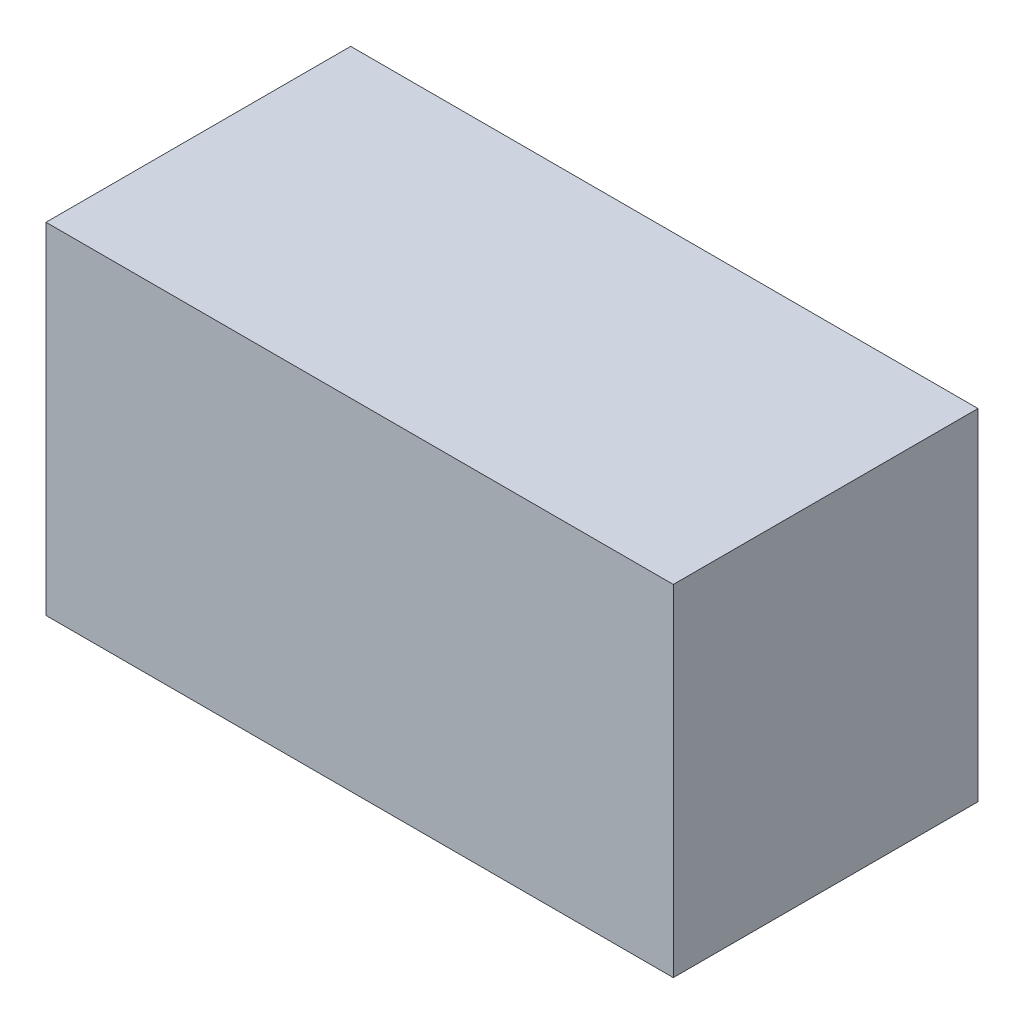
ISO-10303-21;
HEADER;
FILE_DESCRIPTION(('STEP AP214'),'2;1');
FILE_NAME('part.step','',(''),(''),'','','');
FILE_SCHEMA(('AUTOMOTIVE_DESIGN { 1 0 10303 214 1 1 1 1 }'));
ENDSEC;
DATA;
#1=APPLICATION_CONTEXT('core data for automotive mechanical design processes');
#2=APPLICATION_PROTOCOL_DEFINITION('international standard','automotive_design',2000,#1);
#3=PRODUCT_CONTEXT('',#1,'mechanical');
#4=PRODUCT('Part','Part','',(#3));
#5=PRODUCT_RELATED_PRODUCT_CATEGORY('part','',(#4));
#6=PRODUCT_DEFINITION_FORMATION('','',#4);
#7=PRODUCT_DEFINITION_CONTEXT('part definition',#1,'design');
#8=PRODUCT_DEFINITION('design','',#6,#7);
#9=PRODUCT_DEFINITION_SHAPE('','',#8);
#10=(LENGTH_UNIT() NAMED_UNIT(*) SI_UNIT(.MILLI.,.METRE.));
#11=(NAMED_UNIT(*) PLANE_ANGLE_UNIT() SI_UNIT($,.RADIAN.));
#12=(NAMED_UNIT(*) SI_UNIT($,.STERADIAN.) SOLID_ANGLE_UNIT());
#13=UNCERTAINTY_MEASURE_WITH_UNIT(LENGTH_MEASURE(1.E-05),#10,'distance_accuracy_value','');
#14=(GEOMETRIC_REPRESENTATION_CONTEXT(3) GLOBAL_UNCERTAINTY_ASSIGNED_CONTEXT((#13)) GLOBAL_UNIT_ASSIGNED_CONTEXT((#10,
#11,#12)) REPRESENTATION_CONTEXT('',''));
#15=CARTESIAN_POINT('',(0.,0.,0.));
#16=DIRECTION('',(0.,0.,1.));
#17=DIRECTION('',(1.,0.,0.));
#18=AXIS2_PLACEMENT_3D('',#15,#16,#17);
#19=CARTESIAN_POINT('',(-0.87499952,-0.47500032,0.85));
#20=DIRECTION('',(0.,0.,-1.));
#21=DIRECTION('',(-1.,0.,0.));
#22=AXIS2_PLACEMENT_3D('',#19,#20,#21);
#23=PLANE('',#22);
#24=DIRECTION('',(0.,1.,0.));
#25=VECTOR('',#24,1.);
#26=CARTESIAN_POINT('',(0.87499952,-0.47500032,0.85));
#27=LINE('',#26,#25);
#28=CARTESIAN_POINT('',(0.87499952,0.47500032,0.85));
#29=VERTEX_POINT('',#28);
#30=CARTESIAN_POINT('',(0.87499952,-0.47500032,0.85));
#31=VERTEX_POINT('',#30);
#32=EDGE_CURVE('E20',#29,#31,#27,.F.);
#33=ORIENTED_EDGE('',*,*,#32,.F.);
#34=DIRECTION('',(1.,0.,0.));
#35=VECTOR('',#34,1.);
#36=CARTESIAN_POINT('',(0.87499952,0.47500032,0.85));
#37=LINE('',#36,#35);
#38=CARTESIAN_POINT('',(-0.87499952,0.47500032,0.85));
#39=VERTEX_POINT('',#38);
#40=EDGE_CURVE('E55',#29,#39,#37,.F.);
#41=ORIENTED_EDGE('',*,*,#40,.T.);
#42=DIRECTION('',(0.,1.,0.));
#43=VECTOR('',#42,1.);
#44=CARTESIAN_POINT('',(-0.87499952,0.47500032,0.85));
#45=LINE('',#44,#43);
#46=CARTESIAN_POINT('',(-0.87499952,-0.47500032,0.85));
#47=VERTEX_POINT('',#46);
#48=EDGE_CURVE('E58',#39,#47,#45,.F.);
#49=ORIENTED_EDGE('',*,*,#48,.T.);
#50=DIRECTION('',(1.,0.,0.));
#51=VECTOR('',#50,1.);
#52=CARTESIAN_POINT('',(-0.87499952,-0.47500032,0.85));
#53=LINE('',#52,#51);
#54=EDGE_CURVE('E60',#47,#31,#53,.T.);
#55=ORIENTED_EDGE('',*,*,#54,.T.);
#56=EDGE_LOOP('',(#33,#41,#49,#55));
#57=FACE_BOUND('',#56,.T.);
#58=ADVANCED_FACE('F17',(#57),#23,.F.);
#59=CARTESIAN_POINT('',(-0.87499952,-0.47500032,0.));
#60=DIRECTION('',(0.,1.,0.));
#61=DIRECTION('',(0.,0.,1.));
#62=AXIS2_PLACEMENT_3D('',#59,#60,#61);
#63=PLANE('',#62);
#64=DIRECTION('',(-1.,0.,0.));
#65=VECTOR('',#64,1.);
#66=CARTESIAN_POINT('',(-0.87499952,-0.47500032,0.));
#67=LINE('',#66,#65);
#68=CARTESIAN_POINT('',(0.87499952,-0.47500032,0.));
#69=VERTEX_POINT('',#68);
#70=CARTESIAN_POINT('',(-0.87499952,-0.47500032,0.));
#71=VERTEX_POINT('',#70);
#72=EDGE_CURVE('E83',#69,#71,#67,.T.);
#73=ORIENTED_EDGE('',*,*,#72,.F.);
#74=DIRECTION('',(0.,0.,1.));
#75=VECTOR('',#74,1.);
#76=CARTESIAN_POINT('',(0.87499952,-0.47500032,0.));
#77=LINE('',#76,#75);
#78=EDGE_CURVE('E71',#69,#31,#77,.T.);
#79=ORIENTED_EDGE('',*,*,#78,.T.);
#80=ORIENTED_EDGE('',*,*,#54,.F.);
#81=DIRECTION('',(0.,0.,-1.));
#82=VECTOR('',#81,1.);
#83=CARTESIAN_POINT('',(-0.87499952,-0.47500032,0.));
#84=LINE('',#83,#82);
#85=EDGE_CURVE('E65',#47,#71,#84,.T.);
#86=ORIENTED_EDGE('',*,*,#85,.T.);
#87=EDGE_LOOP('',(#73,#79,#80,#86));
#88=FACE_BOUND('',#87,.T.);
#89=ADVANCED_FACE('F68',(#88),#63,.F.);
#90=CARTESIAN_POINT('',(-0.87499952,0.47500032,0.));
#91=DIRECTION('',(1.,0.,0.));
#92=DIRECTION('',(0.,0.,-1.));
#93=AXIS2_PLACEMENT_3D('',#90,#91,#92);
#94=PLANE('',#93);
#95=DIRECTION('',(0.,1.,0.));
#96=VECTOR('',#95,1.);
#97=CARTESIAN_POINT('',(-0.87499952,-0.47500032,0.));
#98=LINE('',#97,#96);
#99=CARTESIAN_POINT('',(-0.87499952,0.47500032,0.));
#100=VERTEX_POINT('',#99);
#101=EDGE_CURVE('E74',#71,#100,#98,.T.);
#102=ORIENTED_EDGE('',*,*,#101,.F.);
#103=ORIENTED_EDGE('',*,*,#85,.F.);
#104=ORIENTED_EDGE('',*,*,#48,.F.);
#105=DIRECTION('',(0.,0.,-1.));
#106=VECTOR('',#105,1.);
#107=CARTESIAN_POINT('',(-0.87499952,0.47500032,0.));
#108=LINE('',#107,#106);
#109=EDGE_CURVE('E77',#39,#100,#108,.T.);
#110=ORIENTED_EDGE('',*,*,#109,.T.);
#111=EDGE_LOOP('',(#102,#103,#104,#110));
#112=FACE_BOUND('',#111,.T.);
#113=ADVANCED_FACE('F72',(#112),#94,.F.);
#114=CARTESIAN_POINT('',(0.87499952,0.47500032,0.));
#115=DIRECTION('',(0.,-1.,0.));
#116=DIRECTION('',(0.,0.,-1.));
#117=AXIS2_PLACEMENT_3D('',#114,#115,#116);
#118=PLANE('',#117);
#119=DIRECTION('',(-1.,0.,0.));
#120=VECTOR('',#119,1.);
#121=CARTESIAN_POINT('',(-0.87499952,0.47500032,0.));
#122=LINE('',#121,#120);
#123=CARTESIAN_POINT('',(0.87499952,0.47500032,0.));
#124=VERTEX_POINT('',#123);
#125=EDGE_CURVE('E26',#100,#124,#122,.F.);
#126=ORIENTED_EDGE('',*,*,#125,.F.);
#127=ORIENTED_EDGE('',*,*,#109,.F.);
#128=ORIENTED_EDGE('',*,*,#40,.F.);
#129=DIRECTION('',(0.,0.,1.));
#130=VECTOR('',#129,1.);
#131=CARTESIAN_POINT('',(0.87499952,0.47500032,0.));
#132=LINE('',#131,#130);
#133=EDGE_CURVE('E35',#29,#124,#132,.F.);
#134=ORIENTED_EDGE('',*,*,#133,.T.);
#135=EDGE_LOOP('',(#126,#127,#128,#134));
#136=FACE_BOUND('',#135,.T.);
#137=ADVANCED_FACE('F89',(#136),#118,.F.);
#138=CARTESIAN_POINT('',(0.87499952,-0.47500032,0.));
#139=DIRECTION('',(-1.,0.,0.));
#140=DIRECTION('',(0.,0.,1.));
#141=AXIS2_PLACEMENT_3D('',#138,#139,#140);
#142=PLANE('',#141);
#143=DIRECTION('',(0.,1.,0.));
#144=VECTOR('',#143,1.);
#145=CARTESIAN_POINT('',(0.87499952,-0.47500032,0.));
#146=LINE('',#145,#144);
#147=EDGE_CURVE('E11',#124,#69,#146,.F.);
#148=ORIENTED_EDGE('',*,*,#147,.F.);
#149=ORIENTED_EDGE('',*,*,#133,.F.);
#150=ORIENTED_EDGE('',*,*,#32,.T.);
#151=ORIENTED_EDGE('',*,*,#78,.F.);
#152=EDGE_LOOP('',(#148,#149,#150,#151));
#153=FACE_BOUND('',#152,.T.);
#154=ADVANCED_FACE('F91',(#153),#142,.F.);
#155=CARTESIAN_POINT('',(-0.87499952,-0.47500032,0.));
#156=DIRECTION('',(0.,0.,-1.));
#157=DIRECTION('',(-1.,0.,0.));
#158=AXIS2_PLACEMENT_3D('',#155,#156,#157);
#159=PLANE('',#158);
#160=ORIENTED_EDGE('',*,*,#125,.T.);
#161=ORIENTED_EDGE('',*,*,#147,.T.);
#162=ORIENTED_EDGE('',*,*,#72,.T.);
#163=ORIENTED_EDGE('',*,*,#101,.T.);
#164=EDGE_LOOP('',(#160,#161,#162,#163));
#165=FACE_BOUND('',#164,.T.);
#166=ADVANCED_FACE('F88',(#165),#159,.T.);
#167=CLOSED_SHELL('',(#58,#89,#113,#137,#154,#166));
#168=MANIFOLD_SOLID_BREP('B1',#167);
#169=ADVANCED_BREP_SHAPE_REPRESENTATION('',(#18,#168),#14);
#170=SHAPE_DEFINITION_REPRESENTATION(#9,#169);
ENDSEC;
END-ISO-10303-21;
